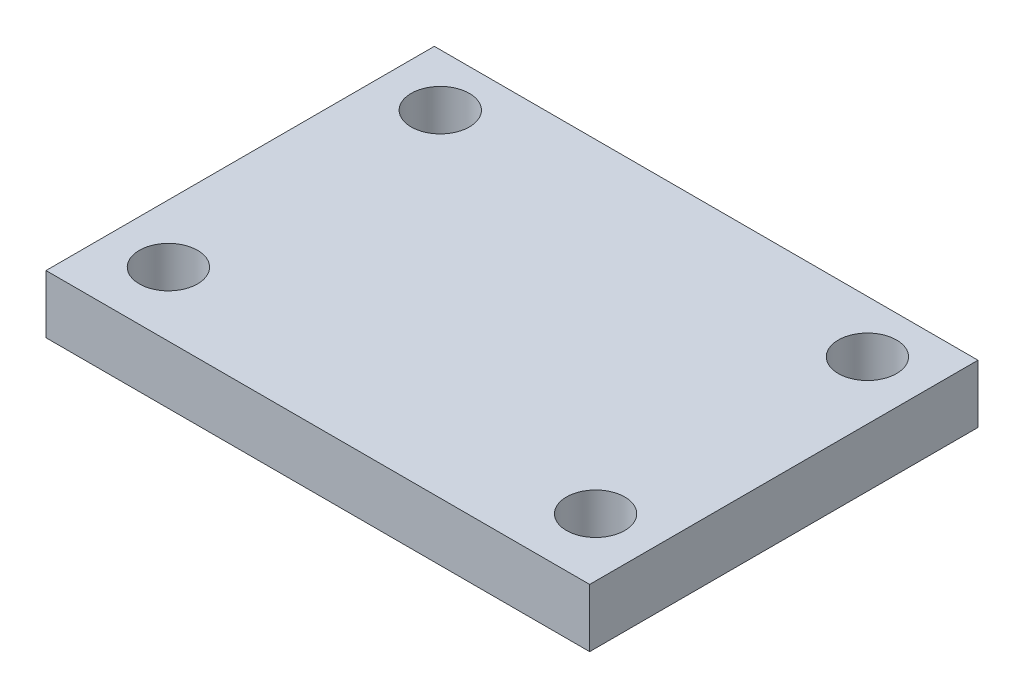
ISO-10303-21;
HEADER;
FILE_DESCRIPTION(('STEP AP214'),'2;1');
FILE_NAME('part.step','',(''),(''),'','','');
FILE_SCHEMA(('AUTOMOTIVE_DESIGN { 1 0 10303 214 1 1 1 1 }'));
ENDSEC;
DATA;
#1=APPLICATION_CONTEXT('core data for automotive mechanical design processes');
#2=APPLICATION_PROTOCOL_DEFINITION('international standard','automotive_design',2000,#1);
#3=PRODUCT_CONTEXT('',#1,'mechanical');
#4=PRODUCT('Part','Part','',(#3));
#5=PRODUCT_RELATED_PRODUCT_CATEGORY('part','',(#4));
#6=PRODUCT_DEFINITION_FORMATION('','',#4);
#7=PRODUCT_DEFINITION_CONTEXT('part definition',#1,'design');
#8=PRODUCT_DEFINITION('design','',#6,#7);
#9=PRODUCT_DEFINITION_SHAPE('','',#8);
#10=(LENGTH_UNIT() NAMED_UNIT(*) SI_UNIT(.MILLI.,.METRE.));
#11=(NAMED_UNIT(*) PLANE_ANGLE_UNIT() SI_UNIT($,.RADIAN.));
#12=(NAMED_UNIT(*) SI_UNIT($,.STERADIAN.) SOLID_ANGLE_UNIT());
#13=UNCERTAINTY_MEASURE_WITH_UNIT(LENGTH_MEASURE(1.E-05),#10,'distance_accuracy_value','');
#14=(GEOMETRIC_REPRESENTATION_CONTEXT(3) GLOBAL_UNCERTAINTY_ASSIGNED_CONTEXT((#13)) GLOBAL_UNIT_ASSIGNED_CONTEXT((#10,
#11,#12)) REPRESENTATION_CONTEXT('',''));
#15=CARTESIAN_POINT('',(0.,0.,0.));
#16=DIRECTION('',(0.,0.,1.));
#17=DIRECTION('',(1.,0.,0.));
#18=AXIS2_PLACEMENT_3D('',#15,#16,#17);
#19=CARTESIAN_POINT('',(14.,3.,-10.));
#20=DIRECTION('',(-1.,0.,0.));
#21=DIRECTION('',(0.,0.,1.));
#22=AXIS2_PLACEMENT_3D('',#19,#20,#21);
#23=PLANE('',#22);
#24=DIRECTION('',(0.,0.,-1.));
#25=VECTOR('',#24,1.);
#26=CARTESIAN_POINT('',(14.,0.,-10.));
#27=LINE('',#26,#25);
#28=CARTESIAN_POINT('',(14.,0.,10.));
#29=VERTEX_POINT('',#28);
#30=CARTESIAN_POINT('',(14.,0.,-10.));
#31=VERTEX_POINT('',#30);
#32=EDGE_CURVE('E100',#29,#31,#27,.T.);
#33=ORIENTED_EDGE('',*,*,#32,.T.);
#34=DIRECTION('',(0.,-1.,0.));
#35=VECTOR('',#34,1.);
#36=CARTESIAN_POINT('',(14.,3.,-10.));
#37=LINE('',#36,#35);
#38=CARTESIAN_POINT('',(14.,3.,-10.));
#39=VERTEX_POINT('',#38);
#40=EDGE_CURVE('E11',#39,#31,#37,.T.);
#41=ORIENTED_EDGE('',*,*,#40,.F.);
#42=DIRECTION('',(0.,0.,-1.));
#43=VECTOR('',#42,1.);
#44=CARTESIAN_POINT('',(14.,3.,-10.));
#45=LINE('',#44,#43);
#46=CARTESIAN_POINT('',(14.,3.,10.));
#47=VERTEX_POINT('',#46);
#48=EDGE_CURVE('E88',#47,#39,#45,.T.);
#49=ORIENTED_EDGE('',*,*,#48,.F.);
#50=DIRECTION('',(0.,-1.,0.));
#51=VECTOR('',#50,1.);
#52=CARTESIAN_POINT('',(14.,3.,10.));
#53=LINE('',#52,#51);
#54=EDGE_CURVE('E96',#47,#29,#53,.T.);
#55=ORIENTED_EDGE('',*,*,#54,.T.);
#56=EDGE_LOOP('',(#33,#41,#49,#55));
#57=FACE_BOUND('',#56,.T.);
#58=ADVANCED_FACE('F37',(#57),#23,.F.);
#59=CARTESIAN_POINT('',(-14.,3.,-10.));
#60=DIRECTION('',(0.,0.,1.));
#61=DIRECTION('',(1.,0.,0.));
#62=AXIS2_PLACEMENT_3D('',#59,#60,#61);
#63=PLANE('',#62);
#64=DIRECTION('',(-1.,0.,0.));
#65=VECTOR('',#64,1.);
#66=CARTESIAN_POINT('',(-14.,0.,-10.));
#67=LINE('',#66,#65);
#68=CARTESIAN_POINT('',(-14.,0.,-10.));
#69=VERTEX_POINT('',#68);
#70=EDGE_CURVE('E92',#31,#69,#67,.T.);
#71=ORIENTED_EDGE('',*,*,#70,.T.);
#72=DIRECTION('',(0.,-1.,0.));
#73=VECTOR('',#72,1.);
#74=CARTESIAN_POINT('',(-14.,3.,-10.));
#75=LINE('',#74,#73);
#76=CARTESIAN_POINT('',(-14.,3.,-10.));
#77=VERTEX_POINT('',#76);
#78=EDGE_CURVE('E45',#77,#69,#75,.T.);
#79=ORIENTED_EDGE('',*,*,#78,.F.);
#80=DIRECTION('',(-1.,0.,0.));
#81=VECTOR('',#80,1.);
#82=CARTESIAN_POINT('',(-14.,3.,-10.));
#83=LINE('',#82,#81);
#84=EDGE_CURVE('E83',#39,#77,#83,.T.);
#85=ORIENTED_EDGE('',*,*,#84,.F.);
#86=ORIENTED_EDGE('',*,*,#40,.T.);
#87=EDGE_LOOP('',(#71,#79,#85,#86));
#88=FACE_BOUND('',#87,.T.);
#89=ADVANCED_FACE('F91',(#88),#63,.F.);
#90=CARTESIAN_POINT('',(-14.,3.,-10.));
#91=DIRECTION('',(1.,0.,0.));
#92=DIRECTION('',(0.,0.,-1.));
#93=AXIS2_PLACEMENT_3D('',#90,#91,#92);
#94=PLANE('',#93);
#95=DIRECTION('',(0.,0.,1.));
#96=VECTOR('',#95,1.);
#97=CARTESIAN_POINT('',(-14.,0.,-10.));
#98=LINE('',#97,#96);
#99=CARTESIAN_POINT('',(-14.,0.,10.));
#100=VERTEX_POINT('',#99);
#101=EDGE_CURVE('E70',#69,#100,#98,.T.);
#102=ORIENTED_EDGE('',*,*,#101,.T.);
#103=DIRECTION('',(0.,-1.,0.));
#104=VECTOR('',#103,1.);
#105=CARTESIAN_POINT('',(-14.,3.,10.));
#106=LINE('',#105,#104);
#107=CARTESIAN_POINT('',(-14.,3.,10.));
#108=VERTEX_POINT('',#107);
#109=EDGE_CURVE('E93',#108,#100,#106,.T.);
#110=ORIENTED_EDGE('',*,*,#109,.F.);
#111=DIRECTION('',(0.,0.,1.));
#112=VECTOR('',#111,1.);
#113=CARTESIAN_POINT('',(-14.,3.,-10.));
#114=LINE('',#113,#112);
#115=EDGE_CURVE('E86',#77,#108,#114,.T.);
#116=ORIENTED_EDGE('',*,*,#115,.F.);
#117=ORIENTED_EDGE('',*,*,#78,.T.);
#118=EDGE_LOOP('',(#102,#110,#116,#117));
#119=FACE_BOUND('',#118,.T.);
#120=ADVANCED_FACE('F94',(#119),#94,.F.);
#121=CARTESIAN_POINT('',(-14.,3.,10.));
#122=DIRECTION('',(0.,0.,-1.));
#123=DIRECTION('',(-1.,0.,0.));
#124=AXIS2_PLACEMENT_3D('',#121,#122,#123);
#125=PLANE('',#124);
#126=DIRECTION('',(1.,0.,0.));
#127=VECTOR('',#126,1.);
#128=CARTESIAN_POINT('',(-14.,0.,10.));
#129=LINE('',#128,#127);
#130=EDGE_CURVE('E76',#100,#29,#129,.T.);
#131=ORIENTED_EDGE('',*,*,#130,.T.);
#132=ORIENTED_EDGE('',*,*,#54,.F.);
#133=DIRECTION('',(1.,0.,0.));
#134=VECTOR('',#133,1.);
#135=CARTESIAN_POINT('',(-14.,3.,10.));
#136=LINE('',#135,#134);
#137=EDGE_CURVE('E53',#108,#47,#136,.T.);
#138=ORIENTED_EDGE('',*,*,#137,.F.);
#139=ORIENTED_EDGE('',*,*,#109,.T.);
#140=EDGE_LOOP('',(#131,#132,#138,#139));
#141=FACE_BOUND('',#140,.T.);
#142=ADVANCED_FACE('F108',(#141),#125,.F.);
#143=CARTESIAN_POINT('',(0.,3.,0.));
#144=DIRECTION('',(0.,1.,0.));
#145=DIRECTION('',(0.,0.,1.));
#146=AXIS2_PLACEMENT_3D('',#143,#144,#145);
#147=PLANE('',#146);
#148=CARTESIAN_POINT('',(11.,3.,-7.30550284629981));
#149=DIRECTION('',(0.,-1.,0.));
#150=DIRECTION('',(0.,0.,-1.));
#151=AXIS2_PLACEMENT_3D('',#148,#149,#150);
#152=CIRCLE('',#151,1.5);
#153=CARTESIAN_POINT('',(11.,3.,-8.80550284629981));
#154=VERTEX_POINT('',#153);
#155=EDGE_CURVE('E131',#154,#154,#152,.T.);
#156=ORIENTED_EDGE('',*,*,#155,.T.);
#157=EDGE_LOOP('',(#156));
#158=FACE_BOUND('',#157,.T.);
#159=CARTESIAN_POINT('',(-11.,3.,-7.30550284629981));
#160=DIRECTION('',(0.,-1.,0.));
#161=DIRECTION('',(0.,0.,-1.));
#162=AXIS2_PLACEMENT_3D('',#159,#160,#161);
#163=CIRCLE('',#162,1.5);
#164=CARTESIAN_POINT('',(-11.,3.,-8.80550284629981));
#165=VERTEX_POINT('',#164);
#166=EDGE_CURVE('E125',#165,#165,#163,.T.);
#167=ORIENTED_EDGE('',*,*,#166,.T.);
#168=EDGE_LOOP('',(#167));
#169=FACE_BOUND('',#168,.T.);
#170=CARTESIAN_POINT('',(-11.,3.,6.69449715370019));
#171=DIRECTION('',(0.,-1.,0.));
#172=DIRECTION('',(0.,0.,-1.));
#173=AXIS2_PLACEMENT_3D('',#170,#171,#172);
#174=CIRCLE('',#173,1.5);
#175=CARTESIAN_POINT('',(-11.,3.,5.19449715370019));
#176=VERTEX_POINT('',#175);
#177=EDGE_CURVE('E119',#176,#176,#174,.T.);
#178=ORIENTED_EDGE('',*,*,#177,.T.);
#179=EDGE_LOOP('',(#178));
#180=FACE_BOUND('',#179,.T.);
#181=CARTESIAN_POINT('',(11.,3.,6.69449715370019));
#182=DIRECTION('',(0.,-1.,0.));
#183=DIRECTION('',(0.,0.,-1.));
#184=AXIS2_PLACEMENT_3D('',#181,#182,#183);
#185=CIRCLE('',#184,1.5);
#186=CARTESIAN_POINT('',(11.,3.,5.19449715370019));
#187=VERTEX_POINT('',#186);
#188=EDGE_CURVE('E103',#187,#187,#185,.T.);
#189=ORIENTED_EDGE('',*,*,#188,.T.);
#190=EDGE_LOOP('',(#189));
#191=FACE_BOUND('',#190,.T.);
#192=ORIENTED_EDGE('',*,*,#48,.T.);
#193=ORIENTED_EDGE('',*,*,#84,.T.);
#194=ORIENTED_EDGE('',*,*,#115,.T.);
#195=ORIENTED_EDGE('',*,*,#137,.T.);
#196=EDGE_LOOP('',(#192,#193,#194,#195));
#197=FACE_BOUND('',#196,.T.);
#198=ADVANCED_FACE('F84',(#158,#169,#180,#191,#197),#147,.T.);
#199=CARTESIAN_POINT('',(0.,0.,0.));
#200=DIRECTION('',(0.,1.,0.));
#201=DIRECTION('',(0.,0.,1.));
#202=AXIS2_PLACEMENT_3D('',#199,#200,#201);
#203=PLANE('',#202);
#204=CARTESIAN_POINT('',(11.,0.,-7.30550284629981));
#205=DIRECTION('',(0.,-1.,0.));
#206=DIRECTION('',(0.,0.,-1.));
#207=AXIS2_PLACEMENT_3D('',#204,#205,#206);
#208=CIRCLE('',#207,1.49999999999999);
#209=CARTESIAN_POINT('',(11.,0.,-8.8055028462998));
#210=VERTEX_POINT('',#209);
#211=EDGE_CURVE('E134',#210,#210,#208,.T.);
#212=ORIENTED_EDGE('',*,*,#211,.F.);
#213=EDGE_LOOP('',(#212));
#214=FACE_BOUND('',#213,.T.);
#215=CARTESIAN_POINT('',(-11.,0.,-7.30550284629981));
#216=DIRECTION('',(0.,-1.,0.));
#217=DIRECTION('',(0.,0.,-1.));
#218=AXIS2_PLACEMENT_3D('',#215,#216,#217);
#219=CIRCLE('',#218,1.49999999999999);
#220=CARTESIAN_POINT('',(-11.,0.,-8.8055028462998));
#221=VERTEX_POINT('',#220);
#222=EDGE_CURVE('E128',#221,#221,#219,.T.);
#223=ORIENTED_EDGE('',*,*,#222,.F.);
#224=EDGE_LOOP('',(#223));
#225=FACE_BOUND('',#224,.T.);
#226=CARTESIAN_POINT('',(-11.,0.,6.69449715370019));
#227=DIRECTION('',(0.,-1.,0.));
#228=DIRECTION('',(0.,0.,-1.));
#229=AXIS2_PLACEMENT_3D('',#226,#227,#228);
#230=CIRCLE('',#229,1.49999999999999);
#231=CARTESIAN_POINT('',(-11.,0.,5.1944971537002));
#232=VERTEX_POINT('',#231);
#233=EDGE_CURVE('E122',#232,#232,#230,.T.);
#234=ORIENTED_EDGE('',*,*,#233,.F.);
#235=EDGE_LOOP('',(#234));
#236=FACE_BOUND('',#235,.T.);
#237=CARTESIAN_POINT('',(11.,0.,6.69449715370019));
#238=DIRECTION('',(0.,-1.,0.));
#239=DIRECTION('',(0.,0.,-1.));
#240=AXIS2_PLACEMENT_3D('',#237,#238,#239);
#241=CIRCLE('',#240,1.49999999999999);
#242=CARTESIAN_POINT('',(11.,0.,5.1944971537002));
#243=VERTEX_POINT('',#242);
#244=EDGE_CURVE('E116',#243,#243,#241,.T.);
#245=ORIENTED_EDGE('',*,*,#244,.F.);
#246=EDGE_LOOP('',(#245));
#247=FACE_BOUND('',#246,.T.);
#248=ORIENTED_EDGE('',*,*,#32,.F.);
#249=ORIENTED_EDGE('',*,*,#130,.F.);
#250=ORIENTED_EDGE('',*,*,#101,.F.);
#251=ORIENTED_EDGE('',*,*,#70,.F.);
#252=EDGE_LOOP('',(#248,#249,#250,#251));
#253=FACE_BOUND('',#252,.T.);
#254=ADVANCED_FACE('F111',(#214,#225,#236,#247,#253),#203,.F.);
#255=CARTESIAN_POINT('',(11.,0.,6.69449715370019));
#256=DIRECTION('',(0.,-1.,0.));
#257=DIRECTION('',(0.,0.,-1.));
#258=AXIS2_PLACEMENT_3D('',#255,#256,#257);
#259=CYLINDRICAL_SURFACE('',#258,1.49999999999999);
#260=ORIENTED_EDGE('',*,*,#188,.F.);
#261=EDGE_LOOP('',(#260));
#262=FACE_BOUND('',#261,.T.);
#263=ORIENTED_EDGE('',*,*,#244,.T.);
#264=EDGE_LOOP('',(#263));
#265=FACE_BOUND('',#264,.T.);
#266=ADVANCED_FACE('F142',(#262,#265),#259,.F.);
#267=CARTESIAN_POINT('',(-11.,0.,6.69449715370019));
#268=DIRECTION('',(0.,-1.,0.));
#269=DIRECTION('',(0.,0.,-1.));
#270=AXIS2_PLACEMENT_3D('',#267,#268,#269);
#271=CYLINDRICAL_SURFACE('',#270,1.49999999999999);
#272=ORIENTED_EDGE('',*,*,#177,.F.);
#273=EDGE_LOOP('',(#272));
#274=FACE_BOUND('',#273,.T.);
#275=ORIENTED_EDGE('',*,*,#233,.T.);
#276=EDGE_LOOP('',(#275));
#277=FACE_BOUND('',#276,.T.);
#278=ADVANCED_FACE('F151',(#274,#277),#271,.F.);
#279=CARTESIAN_POINT('',(-11.,0.,-7.30550284629981));
#280=DIRECTION('',(0.,-1.,0.));
#281=DIRECTION('',(0.,0.,-1.));
#282=AXIS2_PLACEMENT_3D('',#279,#280,#281);
#283=CYLINDRICAL_SURFACE('',#282,1.49999999999999);
#284=ORIENTED_EDGE('',*,*,#166,.F.);
#285=EDGE_LOOP('',(#284));
#286=FACE_BOUND('',#285,.T.);
#287=ORIENTED_EDGE('',*,*,#222,.T.);
#288=EDGE_LOOP('',(#287));
#289=FACE_BOUND('',#288,.T.);
#290=ADVANCED_FACE('F157',(#286,#289),#283,.F.);
#291=CARTESIAN_POINT('',(11.,0.,-7.30550284629981));
#292=DIRECTION('',(0.,-1.,0.));
#293=DIRECTION('',(0.,0.,-1.));
#294=AXIS2_PLACEMENT_3D('',#291,#292,#293);
#295=CYLINDRICAL_SURFACE('',#294,1.49999999999999);
#296=ORIENTED_EDGE('',*,*,#155,.F.);
#297=EDGE_LOOP('',(#296));
#298=FACE_BOUND('',#297,.T.);
#299=ORIENTED_EDGE('',*,*,#211,.T.);
#300=EDGE_LOOP('',(#299));
#301=FACE_BOUND('',#300,.T.);
#302=ADVANCED_FACE('F138',(#298,#301),#295,.F.);
#303=CLOSED_SHELL('',(#58,#89,#120,#142,#198,#254,#266,#278,#290,#302));
#304=MANIFOLD_SOLID_BREP('B2',#303);
#305=ADVANCED_BREP_SHAPE_REPRESENTATION('',(#18,#304),#14);
#306=SHAPE_DEFINITION_REPRESENTATION(#9,#305);
ENDSEC;
END-ISO-10303-21;
